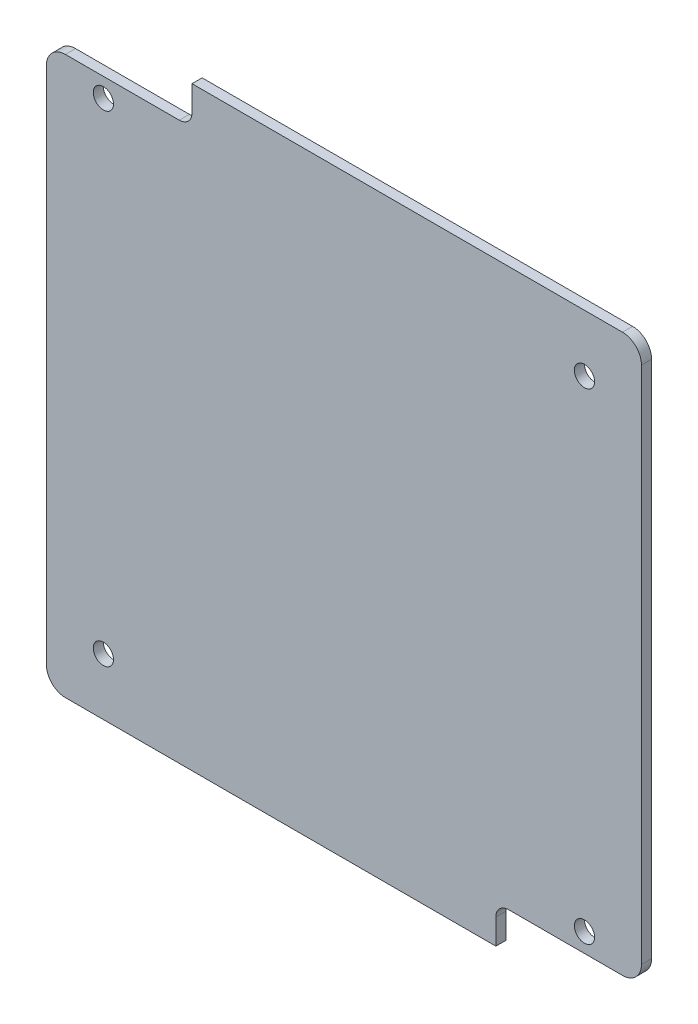
ISO-10303-21;
HEADER;
FILE_DESCRIPTION(('STEP AP214'),'2;1');
FILE_NAME('part.step','',(''),(''),'','','');
FILE_SCHEMA(('AUTOMOTIVE_DESIGN { 1 0 10303 214 1 1 1 1 }'));
ENDSEC;
DATA;
#1=APPLICATION_CONTEXT('core data for automotive mechanical design processes');
#2=APPLICATION_PROTOCOL_DEFINITION('international standard','automotive_design',2000,#1);
#3=PRODUCT_CONTEXT('',#1,'mechanical');
#4=PRODUCT('Part','Part','',(#3));
#5=PRODUCT_RELATED_PRODUCT_CATEGORY('part','',(#4));
#6=PRODUCT_DEFINITION_FORMATION('','',#4);
#7=PRODUCT_DEFINITION_CONTEXT('part definition',#1,'design');
#8=PRODUCT_DEFINITION('design','',#6,#7);
#9=PRODUCT_DEFINITION_SHAPE('','',#8);
#10=(LENGTH_UNIT() NAMED_UNIT(*) SI_UNIT(.MILLI.,.METRE.));
#11=(NAMED_UNIT(*) PLANE_ANGLE_UNIT() SI_UNIT($,.RADIAN.));
#12=(NAMED_UNIT(*) SI_UNIT($,.STERADIAN.) SOLID_ANGLE_UNIT());
#13=UNCERTAINTY_MEASURE_WITH_UNIT(LENGTH_MEASURE(1.E-05),#10,'distance_accuracy_value','');
#14=(GEOMETRIC_REPRESENTATION_CONTEXT(3) GLOBAL_UNCERTAINTY_ASSIGNED_CONTEXT((#13)) GLOBAL_UNIT_ASSIGNED_CONTEXT((#10,
#11,#12)) REPRESENTATION_CONTEXT('',''));
#15=CARTESIAN_POINT('',(0.,0.,0.));
#16=DIRECTION('',(0.,0.,1.));
#17=DIRECTION('',(1.,0.,0.));
#18=AXIS2_PLACEMENT_3D('',#15,#16,#17);
#19=CARTESIAN_POINT('',(-64.5653438799531,91.9518569300749,1.6));
#20=DIRECTION('',(1.,0.,0.));
#21=DIRECTION('',(0.,0.,-1.));
#22=AXIS2_PLACEMENT_3D('',#19,#20,#21);
#23=PLANE('',#22);
#24=DIRECTION('',(0.,-1.,0.));
#25=VECTOR('',#24,1.);
#26=CARTESIAN_POINT('',(-64.5653438799531,91.9518569300749,0.));
#27=LINE('',#26,#25);
#28=CARTESIAN_POINT('',(-64.5653438799531,91.9518569300749,0.));
#29=VERTEX_POINT('',#28);
#30=CARTESIAN_POINT('',(-64.5653438799531,87.9518569300749,0.));
#31=VERTEX_POINT('',#30);
#32=EDGE_CURVE('E164',#29,#31,#27,.T.);
#33=ORIENTED_EDGE('',*,*,#32,.T.);
#34=DIRECTION('',(0.,0.,-1.));
#35=VECTOR('',#34,1.);
#36=CARTESIAN_POINT('',(-64.5653438799531,87.9518569300749,1.6));
#37=LINE('',#36,#35);
#38=CARTESIAN_POINT('',(-64.5653438799531,87.9518569300749,1.6));
#39=VERTEX_POINT('',#38);
#40=EDGE_CURVE('E11',#39,#31,#37,.T.);
#41=ORIENTED_EDGE('',*,*,#40,.F.);
#42=DIRECTION('',(0.,-1.,0.));
#43=VECTOR('',#42,1.);
#44=CARTESIAN_POINT('',(-64.5653438799531,91.9518569300749,1.6));
#45=LINE('',#44,#43);
#46=CARTESIAN_POINT('',(-64.5653438799531,91.9518569300749,1.6));
#47=VERTEX_POINT('',#46);
#48=EDGE_CURVE('E191',#47,#39,#45,.T.);
#49=ORIENTED_EDGE('',*,*,#48,.F.);
#50=DIRECTION('',(0.,0.,-1.));
#51=VECTOR('',#50,1.);
#52=CARTESIAN_POINT('',(-64.5653438799531,91.9518569300749,1.6));
#53=LINE('',#52,#51);
#54=EDGE_CURVE('E160',#47,#29,#53,.T.);
#55=ORIENTED_EDGE('',*,*,#54,.T.);
#56=EDGE_LOOP('',(#33,#41,#49,#55));
#57=FACE_BOUND('',#56,.T.);
#58=ADVANCED_FACE('F32',(#57),#23,.F.);
#59=CARTESIAN_POINT('',(-66.5653438799531,87.9518569300749,1.6));
#60=DIRECTION('',(0.,0.,-1.));
#61=DIRECTION('',(-1.,0.,0.));
#62=AXIS2_PLACEMENT_3D('',#59,#60,#61);
#63=CYLINDRICAL_SURFACE('',#62,2.);
#64=CARTESIAN_POINT('',(-66.5653438799531,87.9518569300749,0.));
#65=DIRECTION('',(0.,0.,-1.));
#66=DIRECTION('',(-1.,0.,0.));
#67=AXIS2_PLACEMENT_3D('',#64,#65,#66);
#68=CIRCLE('',#67,2.);
#69=CARTESIAN_POINT('',(-66.5653438799531,85.9518569300749,0.));
#70=VERTEX_POINT('',#69);
#71=EDGE_CURVE('E167',#31,#70,#68,.T.);
#72=ORIENTED_EDGE('',*,*,#71,.T.);
#73=DIRECTION('',(0.,0.,-1.));
#74=VECTOR('',#73,1.);
#75=CARTESIAN_POINT('',(-66.5653438799531,85.9518569300749,1.6));
#76=LINE('',#75,#74);
#77=CARTESIAN_POINT('',(-66.5653438799531,85.9518569300749,1.6));
#78=VERTEX_POINT('',#77);
#79=EDGE_CURVE('E40',#78,#70,#76,.T.);
#80=ORIENTED_EDGE('',*,*,#79,.F.);
#81=CARTESIAN_POINT('',(-66.5653438799531,87.9518569300749,1.6));
#82=DIRECTION('',(0.,0.,-1.));
#83=DIRECTION('',(-1.,0.,0.));
#84=AXIS2_PLACEMENT_3D('',#81,#82,#83);
#85=CIRCLE('',#84,2.);
#86=EDGE_CURVE('E109',#39,#78,#85,.T.);
#87=ORIENTED_EDGE('',*,*,#86,.F.);
#88=ORIENTED_EDGE('',*,*,#40,.T.);
#89=EDGE_LOOP('',(#72,#80,#87,#88));
#90=FACE_BOUND('',#89,.T.);
#91=ADVANCED_FACE('F280',(#90),#63,.F.);
#92=CARTESIAN_POINT('',(-66.5653438799531,85.9518569300749,1.6));
#93=DIRECTION('',(0.,-1.,0.));
#94=DIRECTION('',(0.,0.,-1.));
#95=AXIS2_PLACEMENT_3D('',#92,#93,#94);
#96=PLANE('',#95);
#97=DIRECTION('',(-1.,0.,0.));
#98=VECTOR('',#97,1.);
#99=CARTESIAN_POINT('',(-66.5653438799531,85.9518569300749,0.));
#100=LINE('',#99,#98);
#101=CARTESIAN_POINT('',(-84.5653438799531,85.9518569300749,0.));
#102=VERTEX_POINT('',#101);
#103=EDGE_CURVE('E170',#70,#102,#100,.T.);
#104=ORIENTED_EDGE('',*,*,#103,.T.);
#105=DIRECTION('',(0.,0.,-1.));
#106=VECTOR('',#105,1.);
#107=CARTESIAN_POINT('',(-84.5653438799531,85.9518569300749,1.6));
#108=LINE('',#107,#106);
#109=CARTESIAN_POINT('',(-84.5653438799531,85.9518569300749,1.6));
#110=VERTEX_POINT('',#109);
#111=EDGE_CURVE('E216',#110,#102,#108,.T.);
#112=ORIENTED_EDGE('',*,*,#111,.F.);
#113=DIRECTION('',(-1.,0.,0.));
#114=VECTOR('',#113,1.);
#115=CARTESIAN_POINT('',(-66.5653438799531,85.9518569300749,1.6));
#116=LINE('',#115,#114);
#117=EDGE_CURVE('E224',#78,#110,#116,.T.);
#118=ORIENTED_EDGE('',*,*,#117,.F.);
#119=ORIENTED_EDGE('',*,*,#79,.T.);
#120=EDGE_LOOP('',(#104,#112,#118,#119));
#121=FACE_BOUND('',#120,.T.);
#122=ADVANCED_FACE('F222',(#121),#96,.F.);
#123=CARTESIAN_POINT('',(-84.5653438799531,82.9518569300749,1.6));
#124=DIRECTION('',(0.,0.,-1.));
#125=DIRECTION('',(-1.,0.,0.));
#126=AXIS2_PLACEMENT_3D('',#123,#124,#125);
#127=CYLINDRICAL_SURFACE('',#126,3.);
#128=CARTESIAN_POINT('',(-84.5653438799531,82.9518569300749,0.));
#129=DIRECTION('',(0.,0.,1.));
#130=DIRECTION('',(1.,0.,0.));
#131=AXIS2_PLACEMENT_3D('',#128,#129,#130);
#132=CIRCLE('',#131,3.);
#133=CARTESIAN_POINT('',(-87.5653438799531,82.9518569300748,0.));
#134=VERTEX_POINT('',#133);
#135=EDGE_CURVE('E172',#102,#134,#132,.T.);
#136=ORIENTED_EDGE('',*,*,#135,.T.);
#137=DIRECTION('',(0.,0.,-1.));
#138=VECTOR('',#137,1.);
#139=CARTESIAN_POINT('',(-87.5653438799531,82.9518569300748,1.6));
#140=LINE('',#139,#138);
#141=CARTESIAN_POINT('',(-87.5653438799531,82.9518569300748,1.6));
#142=VERTEX_POINT('',#141);
#143=EDGE_CURVE('E213',#142,#134,#140,.T.);
#144=ORIENTED_EDGE('',*,*,#143,.F.);
#145=CARTESIAN_POINT('',(-84.5653438799531,82.9518569300749,1.6));
#146=DIRECTION('',(0.,0.,1.));
#147=DIRECTION('',(1.,0.,0.));
#148=AXIS2_PLACEMENT_3D('',#145,#146,#147);
#149=CIRCLE('',#148,3.);
#150=EDGE_CURVE('E242',#110,#142,#149,.T.);
#151=ORIENTED_EDGE('',*,*,#150,.F.);
#152=ORIENTED_EDGE('',*,*,#111,.T.);
#153=EDGE_LOOP('',(#136,#144,#151,#152));
#154=FACE_BOUND('',#153,.T.);
#155=ADVANCED_FACE('F233',(#154),#127,.T.);
#156=CARTESIAN_POINT('',(-87.5653438799531,0.951856930074922,1.6));
#157=DIRECTION('',(1.,0.,0.));
#158=DIRECTION('',(0.,0.,-1.));
#159=AXIS2_PLACEMENT_3D('',#156,#157,#158);
#160=PLANE('',#159);
#161=DIRECTION('',(0.,-1.,0.));
#162=VECTOR('',#161,1.);
#163=CARTESIAN_POINT('',(-87.5653438799531,0.951856930074922,0.));
#164=LINE('',#163,#162);
#165=CARTESIAN_POINT('',(-87.5653438799531,0.951856930074922,0.));
#166=VERTEX_POINT('',#165);
#167=EDGE_CURVE('E174',#134,#166,#164,.T.);
#168=ORIENTED_EDGE('',*,*,#167,.T.);
#169=DIRECTION('',(0.,0.,-1.));
#170=VECTOR('',#169,1.);
#171=CARTESIAN_POINT('',(-87.5653438799531,0.951856930074922,1.6));
#172=LINE('',#171,#170);
#173=CARTESIAN_POINT('',(-87.5653438799531,0.951856930074922,1.6));
#174=VERTEX_POINT('',#173);
#175=EDGE_CURVE('E210',#174,#166,#172,.T.);
#176=ORIENTED_EDGE('',*,*,#175,.F.);
#177=DIRECTION('',(0.,-1.,0.));
#178=VECTOR('',#177,1.);
#179=CARTESIAN_POINT('',(-87.5653438799531,0.951856930074922,1.6));
#180=LINE('',#179,#178);
#181=EDGE_CURVE('E239',#142,#174,#180,.T.);
#182=ORIENTED_EDGE('',*,*,#181,.F.);
#183=ORIENTED_EDGE('',*,*,#143,.T.);
#184=EDGE_LOOP('',(#168,#176,#182,#183));
#185=FACE_BOUND('',#184,.T.);
#186=ADVANCED_FACE('F237',(#185),#160,.F.);
#187=CARTESIAN_POINT('',(-84.5653438799531,0.9518569300749,1.6));
#188=DIRECTION('',(0.,0.,-1.));
#189=DIRECTION('',(-1.,0.,0.));
#190=AXIS2_PLACEMENT_3D('',#187,#188,#189);
#191=CYLINDRICAL_SURFACE('',#190,3.);
#192=CARTESIAN_POINT('',(-84.5653438799531,0.9518569300749,0.));
#193=DIRECTION('',(0.,0.,1.));
#194=DIRECTION('',(1.,0.,0.));
#195=AXIS2_PLACEMENT_3D('',#192,#193,#194);
#196=CIRCLE('',#195,3.);
#197=CARTESIAN_POINT('',(-84.5653438799531,-2.0481430699251,0.));
#198=VERTEX_POINT('',#197);
#199=EDGE_CURVE('E176',#166,#198,#196,.T.);
#200=ORIENTED_EDGE('',*,*,#199,.T.);
#201=DIRECTION('',(0.,0.,-1.));
#202=VECTOR('',#201,1.);
#203=CARTESIAN_POINT('',(-84.5653438799531,-2.0481430699251,1.6));
#204=LINE('',#203,#202);
#205=CARTESIAN_POINT('',(-84.5653438799531,-2.0481430699251,1.6));
#206=VERTEX_POINT('',#205);
#207=EDGE_CURVE('E207',#206,#198,#204,.T.);
#208=ORIENTED_EDGE('',*,*,#207,.F.);
#209=CARTESIAN_POINT('',(-84.5653438799531,0.9518569300749,1.6));
#210=DIRECTION('',(0.,0.,1.));
#211=DIRECTION('',(1.,0.,0.));
#212=AXIS2_PLACEMENT_3D('',#209,#210,#211);
#213=CIRCLE('',#212,3.);
#214=EDGE_CURVE('E241',#174,#206,#213,.T.);
#215=ORIENTED_EDGE('',*,*,#214,.F.);
#216=ORIENTED_EDGE('',*,*,#175,.T.);
#217=EDGE_LOOP('',(#200,#208,#215,#216));
#218=FACE_BOUND('',#217,.T.);
#219=ADVANCED_FACE('F293',(#218),#191,.T.);
#220=CARTESIAN_POINT('',(-16.5653438799532,-2.0481430699251,1.6));
#221=DIRECTION('',(0.,1.,0.));
#222=DIRECTION('',(-1.,0.,0.));
#223=AXIS2_PLACEMENT_3D('',#220,#221,#222);
#224=PLANE('',#223);
#225=DIRECTION('',(1.,0.,0.));
#226=VECTOR('',#225,1.);
#227=CARTESIAN_POINT('',(-16.5653438799532,-2.0481430699251,0.));
#228=LINE('',#227,#226);
#229=CARTESIAN_POINT('',(-16.5653438799532,-2.0481430699251,0.));
#230=VERTEX_POINT('',#229);
#231=EDGE_CURVE('E178',#198,#230,#228,.T.);
#232=ORIENTED_EDGE('',*,*,#231,.T.);
#233=DIRECTION('',(0.,0.,-1.));
#234=VECTOR('',#233,1.);
#235=CARTESIAN_POINT('',(-16.5653438799532,-2.0481430699251,1.6));
#236=LINE('',#235,#234);
#237=CARTESIAN_POINT('',(-16.5653438799532,-2.0481430699251,1.6));
#238=VERTEX_POINT('',#237);
#239=EDGE_CURVE('E204',#238,#230,#236,.T.);
#240=ORIENTED_EDGE('',*,*,#239,.F.);
#241=DIRECTION('',(1.,0.,0.));
#242=VECTOR('',#241,1.);
#243=CARTESIAN_POINT('',(-16.5653438799532,-2.0481430699251,1.6));
#244=LINE('',#243,#242);
#245=EDGE_CURVE('E244',#206,#238,#244,.T.);
#246=ORIENTED_EDGE('',*,*,#245,.F.);
#247=ORIENTED_EDGE('',*,*,#207,.T.);
#248=EDGE_LOOP('',(#232,#240,#246,#247));
#249=FACE_BOUND('',#248,.T.);
#250=ADVANCED_FACE('F296',(#249),#224,.F.);
#251=CARTESIAN_POINT('',(-16.5653438799532,1.9518569300749,1.6));
#252=DIRECTION('',(-1.,0.,0.));
#253=DIRECTION('',(0.,-1.,0.));
#254=AXIS2_PLACEMENT_3D('',#251,#252,#253);
#255=PLANE('',#254);
#256=DIRECTION('',(0.,1.,0.));
#257=VECTOR('',#256,1.);
#258=CARTESIAN_POINT('',(-16.5653438799532,1.9518569300749,0.));
#259=LINE('',#258,#257);
#260=CARTESIAN_POINT('',(-16.5653438799532,1.9518569300749,0.));
#261=VERTEX_POINT('',#260);
#262=EDGE_CURVE('E180',#230,#261,#259,.T.);
#263=ORIENTED_EDGE('',*,*,#262,.T.);
#264=DIRECTION('',(0.,0.,-1.));
#265=VECTOR('',#264,1.);
#266=CARTESIAN_POINT('',(-16.5653438799532,1.9518569300749,1.6));
#267=LINE('',#266,#265);
#268=CARTESIAN_POINT('',(-16.5653438799532,1.9518569300749,1.6));
#269=VERTEX_POINT('',#268);
#270=EDGE_CURVE('E201',#269,#261,#267,.T.);
#271=ORIENTED_EDGE('',*,*,#270,.F.);
#272=DIRECTION('',(0.,1.,0.));
#273=VECTOR('',#272,1.);
#274=CARTESIAN_POINT('',(-16.5653438799532,1.9518569300749,1.6));
#275=LINE('',#274,#273);
#276=EDGE_CURVE('E250',#238,#269,#275,.T.);
#277=ORIENTED_EDGE('',*,*,#276,.F.);
#278=ORIENTED_EDGE('',*,*,#239,.T.);
#279=EDGE_LOOP('',(#263,#271,#277,#278));
#280=FACE_BOUND('',#279,.T.);
#281=ADVANCED_FACE('F300',(#280),#255,.F.);
#282=CARTESIAN_POINT('',(-14.5653438799532,1.9518569300749,1.6));
#283=DIRECTION('',(0.,0.,-1.));
#284=DIRECTION('',(-1.,0.,0.));
#285=AXIS2_PLACEMENT_3D('',#282,#283,#284);
#286=CYLINDRICAL_SURFACE('',#285,2.);
#287=CARTESIAN_POINT('',(-14.5653438799532,1.9518569300749,0.));
#288=DIRECTION('',(0.,0.,-1.));
#289=DIRECTION('',(1.,0.,0.));
#290=AXIS2_PLACEMENT_3D('',#287,#288,#289);
#291=CIRCLE('',#290,2.);
#292=CARTESIAN_POINT('',(-14.5653438799532,3.9518569300749,0.));
#293=VERTEX_POINT('',#292);
#294=EDGE_CURVE('E182',#261,#293,#291,.T.);
#295=ORIENTED_EDGE('',*,*,#294,.T.);
#296=DIRECTION('',(0.,0.,-1.));
#297=VECTOR('',#296,1.);
#298=CARTESIAN_POINT('',(-14.5653438799532,3.9518569300749,1.6));
#299=LINE('',#298,#297);
#300=CARTESIAN_POINT('',(-14.5653438799532,3.9518569300749,1.6));
#301=VERTEX_POINT('',#300);
#302=EDGE_CURVE('E198',#301,#293,#299,.T.);
#303=ORIENTED_EDGE('',*,*,#302,.F.);
#304=CARTESIAN_POINT('',(-14.5653438799532,1.9518569300749,1.6));
#305=DIRECTION('',(0.,0.,-1.));
#306=DIRECTION('',(1.,0.,0.));
#307=AXIS2_PLACEMENT_3D('',#304,#305,#306);
#308=CIRCLE('',#307,2.);
#309=EDGE_CURVE('E252',#269,#301,#308,.T.);
#310=ORIENTED_EDGE('',*,*,#309,.F.);
#311=ORIENTED_EDGE('',*,*,#270,.T.);
#312=EDGE_LOOP('',(#295,#303,#310,#311));
#313=FACE_BOUND('',#312,.T.);
#314=ADVANCED_FACE('F304',(#313),#286,.F.);
#315=CARTESIAN_POINT('',(-14.5653438799532,3.9518569300749,1.6));
#316=DIRECTION('',(0.,1.,0.));
#317=DIRECTION('',(-1.,0.,0.));
#318=AXIS2_PLACEMENT_3D('',#315,#316,#317);
#319=PLANE('',#318);
#320=DIRECTION('',(1.,0.,0.));
#321=VECTOR('',#320,1.);
#322=CARTESIAN_POINT('',(-14.5653438799532,3.9518569300749,0.));
#323=LINE('',#322,#321);
#324=CARTESIAN_POINT('',(3.43465612004684,3.9518569300749,0.));
#325=VERTEX_POINT('',#324);
#326=EDGE_CURVE('E184',#293,#325,#323,.T.);
#327=ORIENTED_EDGE('',*,*,#326,.T.);
#328=DIRECTION('',(0.,0.,-1.));
#329=VECTOR('',#328,1.);
#330=CARTESIAN_POINT('',(3.43465612004684,3.9518569300749,1.6));
#331=LINE('',#330,#329);
#332=CARTESIAN_POINT('',(3.43465612004684,3.9518569300749,1.6));
#333=VERTEX_POINT('',#332);
#334=EDGE_CURVE('E195',#333,#325,#331,.T.);
#335=ORIENTED_EDGE('',*,*,#334,.F.);
#336=DIRECTION('',(1.,0.,0.));
#337=VECTOR('',#336,1.);
#338=CARTESIAN_POINT('',(-14.5653438799532,3.9518569300749,1.6));
#339=LINE('',#338,#337);
#340=EDGE_CURVE('E254',#301,#333,#339,.T.);
#341=ORIENTED_EDGE('',*,*,#340,.F.);
#342=ORIENTED_EDGE('',*,*,#302,.T.);
#343=EDGE_LOOP('',(#327,#335,#341,#342));
#344=FACE_BOUND('',#343,.T.);
#345=ADVANCED_FACE('F260',(#344),#319,.F.);
#346=CARTESIAN_POINT('',(3.43465612004684,6.9518569300749,1.6));
#347=DIRECTION('',(0.,0.,-1.));
#348=DIRECTION('',(-1.,0.,0.));
#349=AXIS2_PLACEMENT_3D('',#346,#347,#348);
#350=CYLINDRICAL_SURFACE('',#349,3.);
#351=CARTESIAN_POINT('',(3.43465612004684,6.9518569300749,0.));
#352=DIRECTION('',(0.,0.,1.));
#353=DIRECTION('',(1.,0.,0.));
#354=AXIS2_PLACEMENT_3D('',#351,#352,#353);
#355=CIRCLE('',#354,3.);
#356=CARTESIAN_POINT('',(6.43465612004684,6.9518569300749,0.));
#357=VERTEX_POINT('',#356);
#358=EDGE_CURVE('E186',#325,#357,#355,.T.);
#359=ORIENTED_EDGE('',*,*,#358,.T.);
#360=DIRECTION('',(0.,0.,-1.));
#361=VECTOR('',#360,1.);
#362=CARTESIAN_POINT('',(6.43465612004684,6.9518569300749,1.6));
#363=LINE('',#362,#361);
#364=CARTESIAN_POINT('',(6.43465612004684,6.9518569300749,1.6));
#365=VERTEX_POINT('',#364);
#366=EDGE_CURVE('E155',#365,#357,#363,.T.);
#367=ORIENTED_EDGE('',*,*,#366,.F.);
#368=CARTESIAN_POINT('',(3.43465612004684,6.9518569300749,1.6));
#369=DIRECTION('',(0.,0.,1.));
#370=DIRECTION('',(1.,0.,0.));
#371=AXIS2_PLACEMENT_3D('',#368,#369,#370);
#372=CIRCLE('',#371,3.);
#373=EDGE_CURVE('E146',#333,#365,#372,.T.);
#374=ORIENTED_EDGE('',*,*,#373,.F.);
#375=ORIENTED_EDGE('',*,*,#334,.T.);
#376=EDGE_LOOP('',(#359,#367,#374,#375));
#377=FACE_BOUND('',#376,.T.);
#378=ADVANCED_FACE('F264',(#377),#350,.T.);
#379=CARTESIAN_POINT('',(6.43465612004683,88.9518569300748,1.6));
#380=DIRECTION('',(-1.,0.,0.));
#381=DIRECTION('',(0.,-1.,0.));
#382=AXIS2_PLACEMENT_3D('',#379,#380,#381);
#383=PLANE('',#382);
#384=DIRECTION('',(0.,1.,0.));
#385=VECTOR('',#384,1.);
#386=CARTESIAN_POINT('',(6.43465612004683,88.9518569300748,0.));
#387=LINE('',#386,#385);
#388=CARTESIAN_POINT('',(6.43465612004683,88.9518569300748,0.));
#389=VERTEX_POINT('',#388);
#390=EDGE_CURVE('E154',#357,#389,#387,.T.);
#391=ORIENTED_EDGE('',*,*,#390,.T.);
#392=DIRECTION('',(0.,0.,-1.));
#393=VECTOR('',#392,1.);
#394=CARTESIAN_POINT('',(6.43465612004683,88.9518569300748,1.6));
#395=LINE('',#394,#393);
#396=CARTESIAN_POINT('',(6.43465612004683,88.9518569300748,1.6));
#397=VERTEX_POINT('',#396);
#398=EDGE_CURVE('E151',#397,#389,#395,.T.);
#399=ORIENTED_EDGE('',*,*,#398,.F.);
#400=DIRECTION('',(0.,1.,0.));
#401=VECTOR('',#400,1.);
#402=CARTESIAN_POINT('',(6.43465612004683,88.9518569300748,1.6));
#403=LINE('',#402,#401);
#404=EDGE_CURVE('E140',#365,#397,#403,.T.);
#405=ORIENTED_EDGE('',*,*,#404,.F.);
#406=ORIENTED_EDGE('',*,*,#366,.T.);
#407=EDGE_LOOP('',(#391,#399,#405,#406));
#408=FACE_BOUND('',#407,.T.);
#409=ADVANCED_FACE('F152',(#408),#383,.F.);
#410=CARTESIAN_POINT('',(3.43465612004683,88.9518569300749,1.6));
#411=DIRECTION('',(0.,0.,-1.));
#412=DIRECTION('',(-1.,0.,0.));
#413=AXIS2_PLACEMENT_3D('',#410,#411,#412);
#414=CYLINDRICAL_SURFACE('',#413,3.);
#415=CARTESIAN_POINT('',(3.43465612004683,88.9518569300749,0.));
#416=DIRECTION('',(0.,0.,1.));
#417=DIRECTION('',(-1.,0.,0.));
#418=AXIS2_PLACEMENT_3D('',#415,#416,#417);
#419=CIRCLE('',#418,3.);
#420=CARTESIAN_POINT('',(3.43465612004681,91.9518569300749,0.));
#421=VERTEX_POINT('',#420);
#422=EDGE_CURVE('E95',#389,#421,#419,.T.);
#423=ORIENTED_EDGE('',*,*,#422,.T.);
#424=DIRECTION('',(0.,0.,-1.));
#425=VECTOR('',#424,1.);
#426=CARTESIAN_POINT('',(3.43465612004681,91.9518569300749,1.6));
#427=LINE('',#426,#425);
#428=CARTESIAN_POINT('',(3.43465612004681,91.9518569300749,1.6));
#429=VERTEX_POINT('',#428);
#430=EDGE_CURVE('E156',#429,#421,#427,.T.);
#431=ORIENTED_EDGE('',*,*,#430,.F.);
#432=CARTESIAN_POINT('',(3.43465612004683,88.9518569300749,1.6));
#433=DIRECTION('',(0.,0.,1.));
#434=DIRECTION('',(-1.,0.,0.));
#435=AXIS2_PLACEMENT_3D('',#432,#433,#434);
#436=CIRCLE('',#435,3.);
#437=EDGE_CURVE('E144',#397,#429,#436,.T.);
#438=ORIENTED_EDGE('',*,*,#437,.F.);
#439=ORIENTED_EDGE('',*,*,#398,.T.);
#440=EDGE_LOOP('',(#423,#431,#438,#439));
#441=FACE_BOUND('',#440,.T.);
#442=ADVANCED_FACE('F158',(#441),#414,.T.);
#443=CARTESIAN_POINT('',(-64.5653438799531,91.9518569300749,1.6));
#444=DIRECTION('',(0.,-1.,0.));
#445=DIRECTION('',(0.,0.,-1.));
#446=AXIS2_PLACEMENT_3D('',#443,#444,#445);
#447=PLANE('',#446);
#448=DIRECTION('',(-1.,0.,0.));
#449=VECTOR('',#448,1.);
#450=CARTESIAN_POINT('',(-64.5653438799531,91.9518569300749,0.));
#451=LINE('',#450,#449);
#452=EDGE_CURVE('E101',#421,#29,#451,.T.);
#453=ORIENTED_EDGE('',*,*,#452,.T.);
#454=ORIENTED_EDGE('',*,*,#54,.F.);
#455=DIRECTION('',(-1.,0.,0.));
#456=VECTOR('',#455,1.);
#457=CARTESIAN_POINT('',(-64.5653438799531,91.9518569300749,1.6));
#458=LINE('',#457,#456);
#459=EDGE_CURVE('E48',#429,#47,#458,.T.);
#460=ORIENTED_EDGE('',*,*,#459,.F.);
#461=ORIENTED_EDGE('',*,*,#430,.T.);
#462=EDGE_LOOP('',(#453,#454,#460,#461));
#463=FACE_BOUND('',#462,.T.);
#464=ADVANCED_FACE('F268',(#463),#447,.F.);
#465=CARTESIAN_POINT('',(-66.5653438799531,87.9518569300749,1.6));
#466=DIRECTION('',(0.,0.,-1.));
#467=DIRECTION('',(-1.,0.,0.));
#468=AXIS2_PLACEMENT_3D('',#465,#466,#467);
#469=PLANE('',#468);
#470=CARTESIAN_POINT('',(-78.5653438799531,6.95185693007505,1.6));
#471=DIRECTION('',(0.,0.,-1.));
#472=DIRECTION('',(-1.,0.,0.));
#473=AXIS2_PLACEMENT_3D('',#470,#471,#472);
#474=CIRCLE('',#473,1.6);
#475=CARTESIAN_POINT('',(-80.1653438799531,6.95185693007505,1.6));
#476=VERTEX_POINT('',#475);
#477=EDGE_CURVE('E387',#476,#476,#474,.T.);
#478=ORIENTED_EDGE('',*,*,#477,.T.);
#479=EDGE_LOOP('',(#478));
#480=FACE_BOUND('',#479,.T.);
#481=CARTESIAN_POINT('',(-78.5653438799531,82.9518569300751,1.6));
#482=DIRECTION('',(0.,0.,-1.));
#483=DIRECTION('',(-1.,0.,0.));
#484=AXIS2_PLACEMENT_3D('',#481,#482,#483);
#485=CIRCLE('',#484,1.6);
#486=CARTESIAN_POINT('',(-80.1653438799531,82.9518569300751,1.6));
#487=VERTEX_POINT('',#486);
#488=EDGE_CURVE('E397',#487,#487,#485,.T.);
#489=ORIENTED_EDGE('',*,*,#488,.T.);
#490=EDGE_LOOP('',(#489));
#491=FACE_BOUND('',#490,.T.);
#492=CARTESIAN_POINT('',(-2.56534387995312,82.9518569300751,1.6));
#493=DIRECTION('',(0.,0.,-1.));
#494=DIRECTION('',(-1.,0.,0.));
#495=AXIS2_PLACEMENT_3D('',#492,#493,#494);
#496=CIRCLE('',#495,1.59999999999999);
#497=CARTESIAN_POINT('',(-4.16534387995312,82.9518569300751,1.6));
#498=VERTEX_POINT('',#497);
#499=EDGE_CURVE('E403',#498,#498,#496,.T.);
#500=ORIENTED_EDGE('',*,*,#499,.T.);
#501=EDGE_LOOP('',(#500));
#502=FACE_BOUND('',#501,.T.);
#503=CARTESIAN_POINT('',(-2.56534387995309,6.95185693007509,1.6));
#504=DIRECTION('',(0.,0.,-1.));
#505=DIRECTION('',(-1.,0.,0.));
#506=AXIS2_PLACEMENT_3D('',#503,#504,#505);
#507=CIRCLE('',#506,1.59999999999999);
#508=CARTESIAN_POINT('',(-4.16534387995309,6.95185693007509,1.6));
#509=VERTEX_POINT('',#508);
#510=EDGE_CURVE('E168',#509,#509,#507,.T.);
#511=ORIENTED_EDGE('',*,*,#510,.T.);
#512=EDGE_LOOP('',(#511));
#513=FACE_BOUND('',#512,.T.);
#514=ORIENTED_EDGE('',*,*,#48,.T.);
#515=ORIENTED_EDGE('',*,*,#86,.T.);
#516=ORIENTED_EDGE('',*,*,#117,.T.);
#517=ORIENTED_EDGE('',*,*,#150,.T.);
#518=ORIENTED_EDGE('',*,*,#181,.T.);
#519=ORIENTED_EDGE('',*,*,#214,.T.);
#520=ORIENTED_EDGE('',*,*,#245,.T.);
#521=ORIENTED_EDGE('',*,*,#276,.T.);
#522=ORIENTED_EDGE('',*,*,#309,.T.);
#523=ORIENTED_EDGE('',*,*,#340,.T.);
#524=ORIENTED_EDGE('',*,*,#373,.T.);
#525=ORIENTED_EDGE('',*,*,#404,.T.);
#526=ORIENTED_EDGE('',*,*,#437,.T.);
#527=ORIENTED_EDGE('',*,*,#459,.T.);
#528=EDGE_LOOP('',(#514,#515,#516,#517,#518,#519,#520,#521,#522,#523,#524,#525,#526,#527));
#529=FACE_BOUND('',#528,.T.);
#530=ADVANCED_FACE('F142',(#480,#491,#502,#513,#529),#469,.F.);
#531=CARTESIAN_POINT('',(-66.5653438799531,87.9518569300749,0.));
#532=DIRECTION('',(0.,0.,-1.));
#533=DIRECTION('',(-1.,0.,0.));
#534=AXIS2_PLACEMENT_3D('',#531,#532,#533);
#535=PLANE('',#534);
#536=CARTESIAN_POINT('',(-78.5653438799531,6.95185693007505,0.));
#537=DIRECTION('',(0.,0.,-1.));
#538=DIRECTION('',(-1.,0.,0.));
#539=AXIS2_PLACEMENT_3D('',#536,#537,#538);
#540=CIRCLE('',#539,1.59999999999999);
#541=CARTESIAN_POINT('',(-80.1653438799531,6.95185693007505,0.));
#542=VERTEX_POINT('',#541);
#543=EDGE_CURVE('E390',#542,#542,#540,.T.);
#544=ORIENTED_EDGE('',*,*,#543,.F.);
#545=EDGE_LOOP('',(#544));
#546=FACE_BOUND('',#545,.T.);
#547=CARTESIAN_POINT('',(-78.5653438799531,82.9518569300751,0.));
#548=DIRECTION('',(0.,0.,-1.));
#549=DIRECTION('',(-1.,0.,0.));
#550=AXIS2_PLACEMENT_3D('',#547,#548,#549);
#551=CIRCLE('',#550,1.59999999999999);
#552=CARTESIAN_POINT('',(-80.1653438799531,82.9518569300751,0.));
#553=VERTEX_POINT('',#552);
#554=EDGE_CURVE('E392',#553,#553,#551,.T.);
#555=ORIENTED_EDGE('',*,*,#554,.F.);
#556=EDGE_LOOP('',(#555));
#557=FACE_BOUND('',#556,.T.);
#558=CARTESIAN_POINT('',(-2.56534387995312,82.9518569300751,0.));
#559=DIRECTION('',(0.,0.,-1.));
#560=DIRECTION('',(-1.,0.,0.));
#561=AXIS2_PLACEMENT_3D('',#558,#559,#560);
#562=CIRCLE('',#561,1.59999999999999);
#563=CARTESIAN_POINT('',(-4.16534387995311,82.9518569300751,0.));
#564=VERTEX_POINT('',#563);
#565=EDGE_CURVE('E400',#564,#564,#562,.T.);
#566=ORIENTED_EDGE('',*,*,#565,.F.);
#567=EDGE_LOOP('',(#566));
#568=FACE_BOUND('',#567,.T.);
#569=CARTESIAN_POINT('',(-2.56534387995309,6.95185693007509,0.));
#570=DIRECTION('',(0.,0.,-1.));
#571=DIRECTION('',(-1.,0.,0.));
#572=AXIS2_PLACEMENT_3D('',#569,#570,#571);
#573=CIRCLE('',#572,1.59999999999999);
#574=CARTESIAN_POINT('',(-4.16534387995308,6.95185693007509,0.));
#575=VERTEX_POINT('',#574);
#576=EDGE_CURVE('E406',#575,#575,#573,.T.);
#577=ORIENTED_EDGE('',*,*,#576,.F.);
#578=EDGE_LOOP('',(#577));
#579=FACE_BOUND('',#578,.T.);
#580=ORIENTED_EDGE('',*,*,#32,.F.);
#581=ORIENTED_EDGE('',*,*,#452,.F.);
#582=ORIENTED_EDGE('',*,*,#422,.F.);
#583=ORIENTED_EDGE('',*,*,#390,.F.);
#584=ORIENTED_EDGE('',*,*,#358,.F.);
#585=ORIENTED_EDGE('',*,*,#326,.F.);
#586=ORIENTED_EDGE('',*,*,#294,.F.);
#587=ORIENTED_EDGE('',*,*,#262,.F.);
#588=ORIENTED_EDGE('',*,*,#231,.F.);
#589=ORIENTED_EDGE('',*,*,#199,.F.);
#590=ORIENTED_EDGE('',*,*,#167,.F.);
#591=ORIENTED_EDGE('',*,*,#135,.F.);
#592=ORIENTED_EDGE('',*,*,#103,.F.);
#593=ORIENTED_EDGE('',*,*,#71,.F.);
#594=EDGE_LOOP('',(#580,#581,#582,#583,#584,#585,#586,#587,#588,#589,#590,#591,#592,#593));
#595=FACE_BOUND('',#594,.T.);
#596=ADVANCED_FACE('F228',(#546,#557,#568,#579,#595),#535,.T.);
#597=CARTESIAN_POINT('',(-2.56534387995309,6.95185693007509,0.));
#598=DIRECTION('',(0.,0.,-1.));
#599=DIRECTION('',(-1.,0.,0.));
#600=AXIS2_PLACEMENT_3D('',#597,#598,#599);
#601=CYLINDRICAL_SURFACE('',#600,1.59999999999999);
#602=ORIENTED_EDGE('',*,*,#510,.F.);
#603=EDGE_LOOP('',(#602));
#604=FACE_BOUND('',#603,.T.);
#605=ORIENTED_EDGE('',*,*,#576,.T.);
#606=EDGE_LOOP('',(#605));
#607=FACE_BOUND('',#606,.T.);
#608=ADVANCED_FACE('F341',(#604,#607),#601,.F.);
#609=CARTESIAN_POINT('',(-2.56534387995312,82.9518569300751,0.));
#610=DIRECTION('',(0.,0.,-1.));
#611=DIRECTION('',(-1.,0.,0.));
#612=AXIS2_PLACEMENT_3D('',#609,#610,#611);
#613=CYLINDRICAL_SURFACE('',#612,1.59999999999999);
#614=ORIENTED_EDGE('',*,*,#499,.F.);
#615=EDGE_LOOP('',(#614));
#616=FACE_BOUND('',#615,.T.);
#617=ORIENTED_EDGE('',*,*,#565,.T.);
#618=EDGE_LOOP('',(#617));
#619=FACE_BOUND('',#618,.T.);
#620=ADVANCED_FACE('F350',(#616,#619),#613,.F.);
#621=CARTESIAN_POINT('',(-78.5653438799531,82.9518569300751,0.));
#622=DIRECTION('',(0.,0.,-1.));
#623=DIRECTION('',(-1.,0.,0.));
#624=AXIS2_PLACEMENT_3D('',#621,#622,#623);
#625=CYLINDRICAL_SURFACE('',#624,1.6);
#626=ORIENTED_EDGE('',*,*,#488,.F.);
#627=EDGE_LOOP('',(#626));
#628=FACE_BOUND('',#627,.T.);
#629=ORIENTED_EDGE('',*,*,#554,.T.);
#630=EDGE_LOOP('',(#629));
#631=FACE_BOUND('',#630,.T.);
#632=ADVANCED_FACE('F360',(#628,#631),#625,.F.);
#633=CARTESIAN_POINT('',(-78.5653438799531,6.95185693007505,0.));
#634=DIRECTION('',(0.,0.,-1.));
#635=DIRECTION('',(-1.,0.,0.));
#636=AXIS2_PLACEMENT_3D('',#633,#634,#635);
#637=CYLINDRICAL_SURFACE('',#636,1.6);
#638=ORIENTED_EDGE('',*,*,#477,.F.);
#639=EDGE_LOOP('',(#638));
#640=FACE_BOUND('',#639,.T.);
#641=ORIENTED_EDGE('',*,*,#543,.T.);
#642=EDGE_LOOP('',(#641));
#643=FACE_BOUND('',#642,.T.);
#644=ADVANCED_FACE('F370',(#640,#643),#637,.F.);
#645=CLOSED_SHELL('',(#58,#91,#122,#155,#186,#219,#250,#281,#314,#345,#378,#409,#442,#464,#530,
#596,#608,#620,#632,#644));
#646=MANIFOLD_SOLID_BREP('B2',#645);
#647=ADVANCED_BREP_SHAPE_REPRESENTATION('',(#18,#646),#14);
#648=SHAPE_DEFINITION_REPRESENTATION(#9,#647);
ENDSEC;
END-ISO-10303-21;
